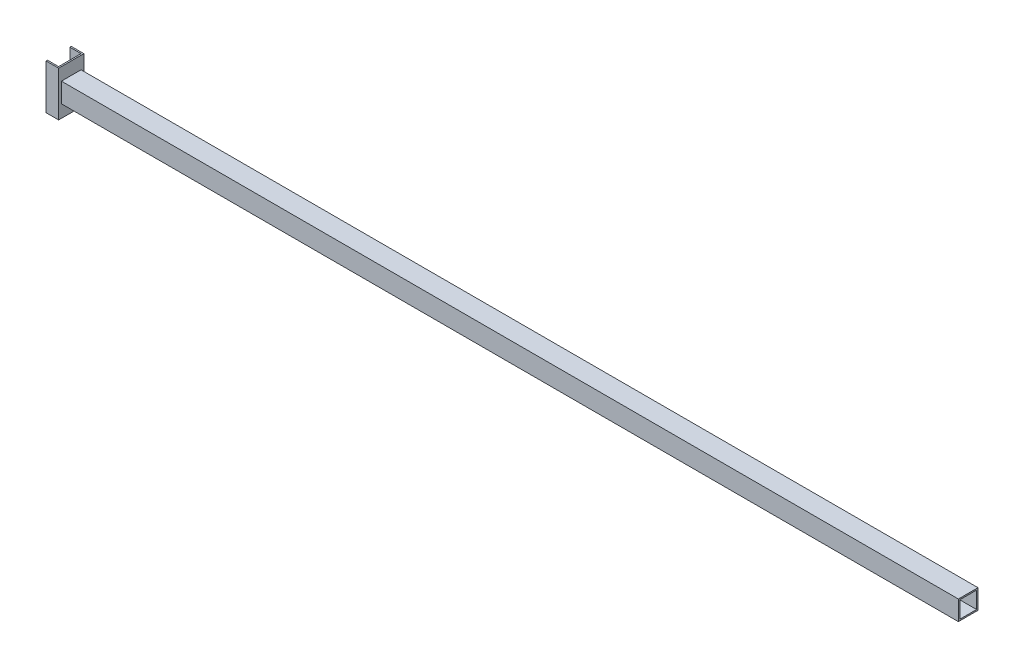
ISO-10303-21;
HEADER;
FILE_DESCRIPTION(('STEP AP214'),'2;1');
FILE_NAME('part.step','',(''),(''),'','','');
FILE_SCHEMA(('AUTOMOTIVE_DESIGN { 1 0 10303 214 1 1 1 1 }'));
ENDSEC;
DATA;
#1=APPLICATION_CONTEXT('core data for automotive mechanical design processes');
#2=APPLICATION_PROTOCOL_DEFINITION('international standard','automotive_design',2000,#1);
#3=PRODUCT_CONTEXT('',#1,'mechanical');
#4=PRODUCT('Part','Part','',(#3));
#5=PRODUCT_RELATED_PRODUCT_CATEGORY('part','',(#4));
#6=PRODUCT_DEFINITION_FORMATION('','',#4);
#7=PRODUCT_DEFINITION_CONTEXT('part definition',#1,'design');
#8=PRODUCT_DEFINITION('design','',#6,#7);
#9=PRODUCT_DEFINITION_SHAPE('','',#8);
#10=(LENGTH_UNIT() NAMED_UNIT(*) SI_UNIT(.MILLI.,.METRE.));
#11=(NAMED_UNIT(*) PLANE_ANGLE_UNIT() SI_UNIT($,.RADIAN.));
#12=(NAMED_UNIT(*) SI_UNIT($,.STERADIAN.) SOLID_ANGLE_UNIT());
#13=UNCERTAINTY_MEASURE_WITH_UNIT(LENGTH_MEASURE(1.E-05),#10,'distance_accuracy_value','');
#14=(GEOMETRIC_REPRESENTATION_CONTEXT(3) GLOBAL_UNCERTAINTY_ASSIGNED_CONTEXT((#13)) GLOBAL_UNIT_ASSIGNED_CONTEXT((#10,
#11,#12)) REPRESENTATION_CONTEXT('',''));
#15=CARTESIAN_POINT('',(0.,0.,0.));
#16=DIRECTION('',(0.,0.,1.));
#17=DIRECTION('',(1.,0.,0.));
#18=AXIS2_PLACEMENT_3D('',#15,#16,#17);
#19=CARTESIAN_POINT('',(-1.5875,0.,0.));
#20=DIRECTION('',(1.,0.,0.));
#21=DIRECTION('',(0.,0.,-1.));
#22=AXIS2_PLACEMENT_3D('',#19,#20,#21);
#23=PLANE('',#22);
#24=DIRECTION('',(0.,0.,1.));
#25=VECTOR('',#24,1.);
#26=CARTESIAN_POINT('',(-1.5875,19.05,-6.35000000000001));
#27=LINE('',#26,#25);
#28=CARTESIAN_POINT('',(-1.5875,19.05,-6.35000000000001));
#29=VERTEX_POINT('',#28);
#30=CARTESIAN_POINT('',(-1.5875,19.05,6.34999999999999));
#31=VERTEX_POINT('',#30);
#32=EDGE_CURVE('E214',#29,#31,#27,.T.);
#33=ORIENTED_EDGE('',*,*,#32,.T.);
#34=DIRECTION('',(0.,-1.,0.));
#35=VECTOR('',#34,1.);
#36=CARTESIAN_POINT('',(-1.5875,19.05,6.34999999999999));
#37=LINE('',#36,#35);
#38=CARTESIAN_POINT('',(-1.5875,12.7,6.34999999999999));
#39=VERTEX_POINT('',#38);
#40=EDGE_CURVE('E229',#31,#39,#37,.T.);
#41=ORIENTED_EDGE('',*,*,#40,.T.);
#42=DIRECTION('',(0.,0.,1.));
#43=VECTOR('',#42,1.);
#44=CARTESIAN_POINT('',(-1.5875,12.7,-6.35000000000001));
#45=LINE('',#44,#43);
#46=CARTESIAN_POINT('',(-1.5875,12.7,-6.35000000000001));
#47=VERTEX_POINT('',#46);
#48=EDGE_CURVE('E232',#47,#39,#45,.T.);
#49=ORIENTED_EDGE('',*,*,#48,.F.);
#50=DIRECTION('',(0.,-1.,0.));
#51=VECTOR('',#50,1.);
#52=CARTESIAN_POINT('',(-1.5875,19.05,-6.35000000000001));
#53=LINE('',#52,#51);
#54=EDGE_CURVE('E225',#29,#47,#53,.T.);
#55=ORIENTED_EDGE('',*,*,#54,.F.);
#56=EDGE_LOOP('',(#33,#41,#49,#55));
#57=FACE_BOUND('',#56,.T.);
#58=DIRECTION('',(0.,0.,-1.));
#59=VECTOR('',#58,1.);
#60=CARTESIAN_POINT('',(-1.5875,25.4,0.));
#61=LINE('',#60,#59);
#62=CARTESIAN_POINT('',(-1.5875,25.4,12.7));
#63=VERTEX_POINT('',#62);
#64=CARTESIAN_POINT('',(-1.5875,25.4,-12.7));
#65=VERTEX_POINT('',#64);
#66=EDGE_CURVE('E366',#63,#65,#61,.T.);
#67=ORIENTED_EDGE('',*,*,#66,.T.);
#68=DIRECTION('',(0.,-1.,0.));
#69=VECTOR('',#68,1.);
#70=CARTESIAN_POINT('',(-1.5875,0.,-12.7));
#71=LINE('',#70,#69);
#72=CARTESIAN_POINT('',(-1.5875,-25.4,-12.7));
#73=VERTEX_POINT('',#72);
#74=EDGE_CURVE('E337',#65,#73,#71,.T.);
#75=ORIENTED_EDGE('',*,*,#74,.T.);
#76=DIRECTION('',(0.,0.,-1.));
#77=VECTOR('',#76,1.);
#78=CARTESIAN_POINT('',(-1.5875,-25.4,0.));
#79=LINE('',#78,#77);
#80=CARTESIAN_POINT('',(-1.5875,-25.4,12.7));
#81=VERTEX_POINT('',#80);
#82=EDGE_CURVE('E363',#81,#73,#79,.T.);
#83=ORIENTED_EDGE('',*,*,#82,.F.);
#84=DIRECTION('',(0.,-1.,0.));
#85=VECTOR('',#84,1.);
#86=CARTESIAN_POINT('',(-1.5875,0.,12.7));
#87=LINE('',#86,#85);
#88=EDGE_CURVE('E357',#63,#81,#87,.T.);
#89=ORIENTED_EDGE('',*,*,#88,.F.);
#90=EDGE_LOOP('',(#67,#75,#83,#89));
#91=FACE_BOUND('',#90,.T.);
#92=DIRECTION('',(0.,0.,1.));
#93=VECTOR('',#92,1.);
#94=CARTESIAN_POINT('',(-1.5875,-6.35,-6.35000000000001));
#95=LINE('',#94,#93);
#96=CARTESIAN_POINT('',(-1.5875,-6.35,-6.35000000000002));
#97=VERTEX_POINT('',#96);
#98=CARTESIAN_POINT('',(-1.5875,-6.35,6.34999999999998));
#99=VERTEX_POINT('',#98);
#100=EDGE_CURVE('E55',#97,#99,#95,.T.);
#101=ORIENTED_EDGE('',*,*,#100,.T.);
#102=DIRECTION('',(0.,-1.,0.));
#103=VECTOR('',#102,1.);
#104=CARTESIAN_POINT('',(-1.5875,-6.35,6.34999999999999));
#105=LINE('',#104,#103);
#106=CARTESIAN_POINT('',(-1.5875,-12.7,6.34999999999999));
#107=VERTEX_POINT('',#106);
#108=EDGE_CURVE('E184',#99,#107,#105,.T.);
#109=ORIENTED_EDGE('',*,*,#108,.T.);
#110=DIRECTION('',(0.,0.,1.));
#111=VECTOR('',#110,1.);
#112=CARTESIAN_POINT('',(-1.5875,-12.7,-6.35000000000001));
#113=LINE('',#112,#111);
#114=CARTESIAN_POINT('',(-1.5875,-12.7,-6.35000000000001));
#115=VERTEX_POINT('',#114);
#116=EDGE_CURVE('E186',#115,#107,#113,.T.);
#117=ORIENTED_EDGE('',*,*,#116,.F.);
#118=DIRECTION('',(0.,-1.,0.));
#119=VECTOR('',#118,1.);
#120=CARTESIAN_POINT('',(-1.5875,-6.35,-6.35000000000001));
#121=LINE('',#120,#119);
#122=EDGE_CURVE('E60',#97,#115,#121,.T.);
#123=ORIENTED_EDGE('',*,*,#122,.F.);
#124=EDGE_LOOP('',(#101,#109,#117,#123));
#125=FACE_BOUND('',#124,.T.);
#126=ADVANCED_FACE('F38',(#57,#91,#125),#23,.F.);
#127=CARTESIAN_POINT('',(0.,0.,0.));
#128=DIRECTION('',(1.,0.,0.));
#129=DIRECTION('',(0.,0.,-1.));
#130=AXIS2_PLACEMENT_3D('',#127,#128,#129);
#131=PLANE('',#130);
#132=DIRECTION('',(0.,0.,-1.));
#133=VECTOR('',#132,1.);
#134=CARTESIAN_POINT('',(0.,-25.4,0.));
#135=LINE('',#134,#133);
#136=CARTESIAN_POINT('',(0.,-25.4,14.2875));
#137=VERTEX_POINT('',#136);
#138=CARTESIAN_POINT('',(0.,-25.4,-14.2875));
#139=VERTEX_POINT('',#138);
#140=EDGE_CURVE('E362',#137,#139,#135,.T.);
#141=ORIENTED_EDGE('',*,*,#140,.T.);
#142=DIRECTION('',(0.,1.,0.));
#143=VECTOR('',#142,1.);
#144=CARTESIAN_POINT('',(0.,0.,-14.2875));
#145=LINE('',#144,#143);
#146=CARTESIAN_POINT('',(0.,25.4,-14.2875));
#147=VERTEX_POINT('',#146);
#148=EDGE_CURVE('E371',#139,#147,#145,.T.);
#149=ORIENTED_EDGE('',*,*,#148,.T.);
#150=DIRECTION('',(0.,0.,-1.));
#151=VECTOR('',#150,1.);
#152=CARTESIAN_POINT('',(0.,25.4,0.));
#153=LINE('',#152,#151);
#154=CARTESIAN_POINT('',(0.,25.4,14.2875));
#155=VERTEX_POINT('',#154);
#156=EDGE_CURVE('E374',#155,#147,#153,.T.);
#157=ORIENTED_EDGE('',*,*,#156,.F.);
#158=DIRECTION('',(0.,1.,0.));
#159=VECTOR('',#158,1.);
#160=CARTESIAN_POINT('',(0.,0.,14.2875));
#161=LINE('',#160,#159);
#162=EDGE_CURVE('E367',#137,#155,#161,.T.);
#163=ORIENTED_EDGE('',*,*,#162,.F.);
#164=EDGE_LOOP('',(#141,#149,#157,#163));
#165=FACE_BOUND('',#164,.T.);
#166=DIRECTION('',(0.,1.,0.));
#167=VECTOR('',#166,1.);
#168=CARTESIAN_POINT('',(0.,0.,-11.1125));
#169=LINE('',#168,#167);
#170=CARTESIAN_POINT('',(0.,-11.1125,-11.1125));
#171=VERTEX_POINT('',#170);
#172=CARTESIAN_POINT('',(0.,11.1125,-11.1125));
#173=VERTEX_POINT('',#172);
#174=EDGE_CURVE('E283',#171,#173,#169,.T.);
#175=ORIENTED_EDGE('',*,*,#174,.F.);
#176=DIRECTION('',(0.,0.,-1.));
#177=VECTOR('',#176,1.);
#178=CARTESIAN_POINT('',(0.,-11.1125,0.));
#179=LINE('',#178,#177);
#180=CARTESIAN_POINT('',(0.,-11.1125,11.1125));
#181=VERTEX_POINT('',#180);
#182=EDGE_CURVE('E228',#181,#171,#179,.T.);
#183=ORIENTED_EDGE('',*,*,#182,.F.);
#184=DIRECTION('',(0.,1.,0.));
#185=VECTOR('',#184,1.);
#186=CARTESIAN_POINT('',(0.,0.,11.1125));
#187=LINE('',#186,#185);
#188=CARTESIAN_POINT('',(0.,11.1125,11.1125));
#189=VERTEX_POINT('',#188);
#190=EDGE_CURVE('E288',#181,#189,#187,.T.);
#191=ORIENTED_EDGE('',*,*,#190,.T.);
#192=DIRECTION('',(0.,0.,-1.));
#193=VECTOR('',#192,1.);
#194=CARTESIAN_POINT('',(0.,11.1125,0.));
#195=LINE('',#194,#193);
#196=EDGE_CURVE('E286',#189,#173,#195,.T.);
#197=ORIENTED_EDGE('',*,*,#196,.T.);
#198=EDGE_LOOP('',(#175,#183,#191,#197));
#199=FACE_BOUND('',#198,.T.);
#200=ADVANCED_FACE('F390',(#165,#199),#131,.T.);
#201=CARTESIAN_POINT('',(-1.5875,-25.4,0.));
#202=DIRECTION('',(0.,-1.,0.));
#203=DIRECTION('',(0.,0.,-1.));
#204=AXIS2_PLACEMENT_3D('',#201,#202,#203);
#205=PLANE('',#204);
#206=ORIENTED_EDGE('',*,*,#82,.T.);
#207=DIRECTION('',(1.,0.,0.));
#208=VECTOR('',#207,1.);
#209=CARTESIAN_POINT('',(-14.2875,-25.4,-12.7));
#210=LINE('',#209,#208);
#211=CARTESIAN_POINT('',(-14.2875,-25.4,-12.7));
#212=VERTEX_POINT('',#211);
#213=EDGE_CURVE('E335',#212,#73,#210,.T.);
#214=ORIENTED_EDGE('',*,*,#213,.F.);
#215=DIRECTION('',(0.,0.,-1.));
#216=VECTOR('',#215,1.);
#217=CARTESIAN_POINT('',(-14.2875,-25.4,0.));
#218=LINE('',#217,#216);
#219=CARTESIAN_POINT('',(-14.2875,-25.4,-14.2875));
#220=VERTEX_POINT('',#219);
#221=EDGE_CURVE('E328',#212,#220,#218,.T.);
#222=ORIENTED_EDGE('',*,*,#221,.T.);
#223=DIRECTION('',(1.,0.,0.));
#224=VECTOR('',#223,1.);
#225=CARTESIAN_POINT('',(-1.5875,-25.4,-14.2875));
#226=LINE('',#225,#224);
#227=EDGE_CURVE('E42',#220,#139,#226,.T.);
#228=ORIENTED_EDGE('',*,*,#227,.T.);
#229=ORIENTED_EDGE('',*,*,#140,.F.);
#230=DIRECTION('',(1.,0.,0.));
#231=VECTOR('',#230,1.);
#232=CARTESIAN_POINT('',(-1.5875,-25.4,14.2875));
#233=LINE('',#232,#231);
#234=CARTESIAN_POINT('',(-14.2875,-25.4,14.2875));
#235=VERTEX_POINT('',#234);
#236=EDGE_CURVE('E12',#235,#137,#233,.T.);
#237=ORIENTED_EDGE('',*,*,#236,.F.);
#238=DIRECTION('',(0.,0.,-1.));
#239=VECTOR('',#238,1.);
#240=CARTESIAN_POINT('',(-14.2875,-25.4,0.));
#241=LINE('',#240,#239);
#242=CARTESIAN_POINT('',(-14.2875,-25.4,12.7));
#243=VERTEX_POINT('',#242);
#244=EDGE_CURVE('E348',#235,#243,#241,.T.);
#245=ORIENTED_EDGE('',*,*,#244,.T.);
#246=DIRECTION('',(1.,0.,0.));
#247=VECTOR('',#246,1.);
#248=CARTESIAN_POINT('',(-14.2875,-25.4,12.7));
#249=LINE('',#248,#247);
#250=EDGE_CURVE('E353',#243,#81,#249,.T.);
#251=ORIENTED_EDGE('',*,*,#250,.T.);
#252=EDGE_LOOP('',(#206,#214,#222,#228,#229,#237,#245,#251));
#253=FACE_BOUND('',#252,.T.);
#254=ADVANCED_FACE('F40',(#253),#205,.T.);
#255=CARTESIAN_POINT('',(-1.5875,0.,14.2875));
#256=DIRECTION('',(0.,0.,-1.));
#257=DIRECTION('',(-1.,0.,0.));
#258=AXIS2_PLACEMENT_3D('',#255,#256,#257);
#259=PLANE('',#258);
#260=ORIENTED_EDGE('',*,*,#162,.T.);
#261=DIRECTION('',(1.,0.,0.));
#262=VECTOR('',#261,1.);
#263=CARTESIAN_POINT('',(-1.5875,25.4,14.2875));
#264=LINE('',#263,#262);
#265=CARTESIAN_POINT('',(-14.2875,25.4,14.2875));
#266=VERTEX_POINT('',#265);
#267=EDGE_CURVE('E47',#266,#155,#264,.T.);
#268=ORIENTED_EDGE('',*,*,#267,.F.);
#269=DIRECTION('',(0.,1.,0.));
#270=VECTOR('',#269,1.);
#271=CARTESIAN_POINT('',(-14.2875,0.,14.2875));
#272=LINE('',#271,#270);
#273=EDGE_CURVE('E345',#235,#266,#272,.T.);
#274=ORIENTED_EDGE('',*,*,#273,.F.);
#275=ORIENTED_EDGE('',*,*,#236,.T.);
#276=EDGE_LOOP('',(#260,#268,#274,#275));
#277=FACE_BOUND('',#276,.T.);
#278=ADVANCED_FACE('F394',(#277),#259,.F.);
#279=CARTESIAN_POINT('',(-1.5875,25.4,0.));
#280=DIRECTION('',(0.,-1.,0.));
#281=DIRECTION('',(0.,0.,-1.));
#282=AXIS2_PLACEMENT_3D('',#279,#280,#281);
#283=PLANE('',#282);
#284=ORIENTED_EDGE('',*,*,#156,.T.);
#285=DIRECTION('',(1.,0.,0.));
#286=VECTOR('',#285,1.);
#287=CARTESIAN_POINT('',(-1.5875,25.4,-14.2875));
#288=LINE('',#287,#286);
#289=CARTESIAN_POINT('',(-14.2875,25.4,-14.2875));
#290=VERTEX_POINT('',#289);
#291=EDGE_CURVE('E378',#290,#147,#288,.T.);
#292=ORIENTED_EDGE('',*,*,#291,.F.);
#293=DIRECTION('',(0.,0.,-1.));
#294=VECTOR('',#293,1.);
#295=CARTESIAN_POINT('',(-14.2875,25.4,0.));
#296=LINE('',#295,#294);
#297=CARTESIAN_POINT('',(-14.2875,25.4,-12.7));
#298=VERTEX_POINT('',#297);
#299=EDGE_CURVE('E312',#298,#290,#296,.T.);
#300=ORIENTED_EDGE('',*,*,#299,.F.);
#301=DIRECTION('',(1.,0.,0.));
#302=VECTOR('',#301,1.);
#303=CARTESIAN_POINT('',(-14.2875,25.4,-12.7));
#304=LINE('',#303,#302);
#305=EDGE_CURVE('E334',#298,#65,#304,.T.);
#306=ORIENTED_EDGE('',*,*,#305,.T.);
#307=ORIENTED_EDGE('',*,*,#66,.F.);
#308=DIRECTION('',(1.,0.,0.));
#309=VECTOR('',#308,1.);
#310=CARTESIAN_POINT('',(-14.2875,25.4,12.7));
#311=LINE('',#310,#309);
#312=CARTESIAN_POINT('',(-14.2875,25.4,12.7));
#313=VERTEX_POINT('',#312);
#314=EDGE_CURVE('E354',#313,#63,#311,.T.);
#315=ORIENTED_EDGE('',*,*,#314,.F.);
#316=DIRECTION('',(0.,0.,-1.));
#317=VECTOR('',#316,1.);
#318=CARTESIAN_POINT('',(-14.2875,25.4,0.));
#319=LINE('',#318,#317);
#320=EDGE_CURVE('E342',#266,#313,#319,.T.);
#321=ORIENTED_EDGE('',*,*,#320,.F.);
#322=ORIENTED_EDGE('',*,*,#267,.T.);
#323=EDGE_LOOP('',(#284,#292,#300,#306,#307,#315,#321,#322));
#324=FACE_BOUND('',#323,.T.);
#325=ADVANCED_FACE('F398',(#324),#283,.F.);
#326=CARTESIAN_POINT('',(-1.5875,0.,-14.2875));
#327=DIRECTION('',(0.,0.,-1.));
#328=DIRECTION('',(-1.,0.,0.));
#329=AXIS2_PLACEMENT_3D('',#326,#327,#328);
#330=PLANE('',#329);
#331=ORIENTED_EDGE('',*,*,#148,.F.);
#332=ORIENTED_EDGE('',*,*,#227,.F.);
#333=DIRECTION('',(0.,1.,0.));
#334=VECTOR('',#333,1.);
#335=CARTESIAN_POINT('',(-14.2875,0.,-14.2875));
#336=LINE('',#335,#334);
#337=EDGE_CURVE('E331',#220,#290,#336,.T.);
#338=ORIENTED_EDGE('',*,*,#337,.T.);
#339=ORIENTED_EDGE('',*,*,#291,.T.);
#340=EDGE_LOOP('',(#331,#332,#338,#339));
#341=FACE_BOUND('',#340,.T.);
#342=ADVANCED_FACE('F387',(#341),#330,.T.);
#343=CARTESIAN_POINT('',(-14.2875,0.,12.7));
#344=DIRECTION('',(0.,0.,1.));
#345=DIRECTION('',(0.,-1.,0.));
#346=AXIS2_PLACEMENT_3D('',#343,#344,#345);
#347=PLANE('',#346);
#348=ORIENTED_EDGE('',*,*,#314,.T.);
#349=ORIENTED_EDGE('',*,*,#88,.T.);
#350=ORIENTED_EDGE('',*,*,#250,.F.);
#351=DIRECTION('',(0.,-1.,0.));
#352=VECTOR('',#351,1.);
#353=CARTESIAN_POINT('',(-14.2875,0.,12.7));
#354=LINE('',#353,#352);
#355=EDGE_CURVE('E351',#313,#243,#354,.T.);
#356=ORIENTED_EDGE('',*,*,#355,.F.);
#357=EDGE_LOOP('',(#348,#349,#350,#356));
#358=FACE_BOUND('',#357,.T.);
#359=ADVANCED_FACE('F406',(#358),#347,.F.);
#360=CARTESIAN_POINT('',(-14.2875,0.,0.));
#361=DIRECTION('',(1.,0.,0.));
#362=DIRECTION('',(0.,0.,-1.));
#363=AXIS2_PLACEMENT_3D('',#360,#361,#362);
#364=PLANE('',#363);
#365=ORIENTED_EDGE('',*,*,#320,.T.);
#366=ORIENTED_EDGE('',*,*,#355,.T.);
#367=ORIENTED_EDGE('',*,*,#244,.F.);
#368=ORIENTED_EDGE('',*,*,#273,.T.);
#369=EDGE_LOOP('',(#365,#366,#367,#368));
#370=FACE_BOUND('',#369,.T.);
#371=ADVANCED_FACE('F402',(#370),#364,.F.);
#372=CARTESIAN_POINT('',(-14.2875,0.,-12.7));
#373=DIRECTION('',(0.,0.,1.));
#374=DIRECTION('',(0.,-1.,0.));
#375=AXIS2_PLACEMENT_3D('',#372,#373,#374);
#376=PLANE('',#375);
#377=ORIENTED_EDGE('',*,*,#74,.F.);
#378=ORIENTED_EDGE('',*,*,#305,.F.);
#379=DIRECTION('',(0.,-1.,0.));
#380=VECTOR('',#379,1.);
#381=CARTESIAN_POINT('',(-14.2875,0.,-12.7));
#382=LINE('',#381,#380);
#383=EDGE_CURVE('E325',#298,#212,#382,.T.);
#384=ORIENTED_EDGE('',*,*,#383,.T.);
#385=ORIENTED_EDGE('',*,*,#213,.T.);
#386=EDGE_LOOP('',(#377,#378,#384,#385));
#387=FACE_BOUND('',#386,.T.);
#388=ADVANCED_FACE('F411',(#387),#376,.T.);
#389=CARTESIAN_POINT('',(-14.2875,0.,0.));
#390=DIRECTION('',(1.,0.,0.));
#391=DIRECTION('',(0.,0.,-1.));
#392=AXIS2_PLACEMENT_3D('',#389,#390,#391);
#393=PLANE('',#392);
#394=ORIENTED_EDGE('',*,*,#299,.T.);
#395=ORIENTED_EDGE('',*,*,#337,.F.);
#396=ORIENTED_EDGE('',*,*,#221,.F.);
#397=ORIENTED_EDGE('',*,*,#383,.F.);
#398=EDGE_LOOP('',(#394,#395,#396,#397));
#399=FACE_BOUND('',#398,.T.);
#400=ADVANCED_FACE('F413',(#399),#393,.F.);
#401=CARTESIAN_POINT('',(1016.,-9.525,0.));
#402=DIRECTION('',(0.,1.,0.));
#403=DIRECTION('',(0.,0.,1.));
#404=AXIS2_PLACEMENT_3D('',#401,#402,#403);
#405=PLANE('',#404);
#406=DIRECTION('',(0.,0.,-1.));
#407=VECTOR('',#406,1.);
#408=CARTESIAN_POINT('',(0.,-9.525,0.));
#409=LINE('',#408,#407);
#410=CARTESIAN_POINT('',(0.,-9.525,9.525));
#411=VERTEX_POINT('',#410);
#412=CARTESIAN_POINT('',(0.,-9.525,-9.525));
#413=VERTEX_POINT('',#412);
#414=EDGE_CURVE('E290',#411,#413,#409,.T.);
#415=ORIENTED_EDGE('',*,*,#414,.F.);
#416=DIRECTION('',(-1.,0.,0.));
#417=VECTOR('',#416,1.);
#418=CARTESIAN_POINT('',(1016.,-9.525,9.525));
#419=LINE('',#418,#417);
#420=CARTESIAN_POINT('',(1016.,-9.525,9.525));
#421=VERTEX_POINT('',#420);
#422=EDGE_CURVE('E309',#421,#411,#419,.T.);
#423=ORIENTED_EDGE('',*,*,#422,.F.);
#424=DIRECTION('',(0.,0.,-1.));
#425=VECTOR('',#424,1.);
#426=CARTESIAN_POINT('',(1016.,-9.525,0.));
#427=LINE('',#426,#425);
#428=CARTESIAN_POINT('',(1016.,-9.525,-9.525));
#429=VERTEX_POINT('',#428);
#430=EDGE_CURVE('E269',#421,#429,#427,.T.);
#431=ORIENTED_EDGE('',*,*,#430,.T.);
#432=DIRECTION('',(-1.,0.,0.));
#433=VECTOR('',#432,1.);
#434=CARTESIAN_POINT('',(1016.,-9.525,-9.525));
#435=LINE('',#434,#433);
#436=EDGE_CURVE('E299',#429,#413,#435,.T.);
#437=ORIENTED_EDGE('',*,*,#436,.T.);
#438=EDGE_LOOP('',(#415,#423,#431,#437));
#439=FACE_BOUND('',#438,.T.);
#440=ADVANCED_FACE('F415',(#439),#405,.T.);
#441=CARTESIAN_POINT('',(1016.,0.,9.525));
#442=DIRECTION('',(0.,0.,1.));
#443=DIRECTION('',(1.,0.,0.));
#444=AXIS2_PLACEMENT_3D('',#441,#442,#443);
#445=PLANE('',#444);
#446=DIRECTION('',(0.,1.,0.));
#447=VECTOR('',#446,1.);
#448=CARTESIAN_POINT('',(0.,0.,9.525));
#449=LINE('',#448,#447);
#450=CARTESIAN_POINT('',(0.,9.525,9.525));
#451=VERTEX_POINT('',#450);
#452=EDGE_CURVE('E292',#411,#451,#449,.T.);
#453=ORIENTED_EDGE('',*,*,#452,.T.);
#454=DIRECTION('',(-1.,0.,0.));
#455=VECTOR('',#454,1.);
#456=CARTESIAN_POINT('',(1016.,9.525,9.525));
#457=LINE('',#456,#455);
#458=CARTESIAN_POINT('',(1016.,9.525,9.525));
#459=VERTEX_POINT('',#458);
#460=EDGE_CURVE('E306',#459,#451,#457,.T.);
#461=ORIENTED_EDGE('',*,*,#460,.F.);
#462=DIRECTION('',(0.,1.,0.));
#463=VECTOR('',#462,1.);
#464=CARTESIAN_POINT('',(1016.,0.,9.525));
#465=LINE('',#464,#463);
#466=EDGE_CURVE('E272',#421,#459,#465,.T.);
#467=ORIENTED_EDGE('',*,*,#466,.F.);
#468=ORIENTED_EDGE('',*,*,#422,.T.);
#469=EDGE_LOOP('',(#453,#461,#467,#468));
#470=FACE_BOUND('',#469,.T.);
#471=ADVANCED_FACE('F421',(#470),#445,.F.);
#472=CARTESIAN_POINT('',(1016.,9.525,0.));
#473=DIRECTION('',(0.,1.,0.));
#474=DIRECTION('',(0.,0.,1.));
#475=AXIS2_PLACEMENT_3D('',#472,#473,#474);
#476=PLANE('',#475);
#477=DIRECTION('',(0.,0.,-1.));
#478=VECTOR('',#477,1.);
#479=CARTESIAN_POINT('',(0.,9.525,0.));
#480=LINE('',#479,#478);
#481=CARTESIAN_POINT('',(0.,9.525,-9.525));
#482=VERTEX_POINT('',#481);
#483=EDGE_CURVE('E295',#451,#482,#480,.T.);
#484=ORIENTED_EDGE('',*,*,#483,.T.);
#485=DIRECTION('',(-1.,0.,0.));
#486=VECTOR('',#485,1.);
#487=CARTESIAN_POINT('',(1016.,9.525,-9.525));
#488=LINE('',#487,#486);
#489=CARTESIAN_POINT('',(1016.,9.525,-9.525));
#490=VERTEX_POINT('',#489);
#491=EDGE_CURVE('E302',#490,#482,#488,.T.);
#492=ORIENTED_EDGE('',*,*,#491,.F.);
#493=DIRECTION('',(0.,0.,-1.));
#494=VECTOR('',#493,1.);
#495=CARTESIAN_POINT('',(1016.,9.525,0.));
#496=LINE('',#495,#494);
#497=EDGE_CURVE('E275',#459,#490,#496,.T.);
#498=ORIENTED_EDGE('',*,*,#497,.F.);
#499=ORIENTED_EDGE('',*,*,#460,.T.);
#500=EDGE_LOOP('',(#484,#492,#498,#499));
#501=FACE_BOUND('',#500,.T.);
#502=ADVANCED_FACE('F486',(#501),#476,.F.);
#503=CARTESIAN_POINT('',(1016.,-11.1125,0.));
#504=DIRECTION('',(0.,1.,0.));
#505=DIRECTION('',(0.,0.,1.));
#506=AXIS2_PLACEMENT_3D('',#503,#504,#505);
#507=PLANE('',#506);
#508=ORIENTED_EDGE('',*,*,#182,.T.);
#509=DIRECTION('',(-1.,0.,0.));
#510=VECTOR('',#509,1.);
#511=CARTESIAN_POINT('',(1016.,-11.1125,-11.1125));
#512=LINE('',#511,#510);
#513=CARTESIAN_POINT('',(1016.,-11.1125,-11.1125));
#514=VERTEX_POINT('',#513);
#515=EDGE_CURVE('E303',#514,#171,#512,.T.);
#516=ORIENTED_EDGE('',*,*,#515,.F.);
#517=DIRECTION('',(0.,0.,-1.));
#518=VECTOR('',#517,1.);
#519=CARTESIAN_POINT('',(1016.,-11.1125,0.));
#520=LINE('',#519,#518);
#521=CARTESIAN_POINT('',(1016.,-11.1125,11.1125));
#522=VERTEX_POINT('',#521);
#523=EDGE_CURVE('E257',#522,#514,#520,.T.);
#524=ORIENTED_EDGE('',*,*,#523,.F.);
#525=DIRECTION('',(-1.,0.,0.));
#526=VECTOR('',#525,1.);
#527=CARTESIAN_POINT('',(1016.,-11.1125,11.1125));
#528=LINE('',#527,#526);
#529=EDGE_CURVE('E280',#522,#181,#528,.T.);
#530=ORIENTED_EDGE('',*,*,#529,.T.);
#531=EDGE_LOOP('',(#508,#516,#524,#530));
#532=FACE_BOUND('',#531,.T.);
#533=ADVANCED_FACE('F496',(#532),#507,.F.);
#534=CARTESIAN_POINT('',(1016.,0.,-11.1125));
#535=DIRECTION('',(0.,0.,1.));
#536=DIRECTION('',(1.,0.,0.));
#537=AXIS2_PLACEMENT_3D('',#534,#535,#536);
#538=PLANE('',#537);
#539=ORIENTED_EDGE('',*,*,#174,.T.);
#540=DIRECTION('',(-1.,0.,0.));
#541=VECTOR('',#540,1.);
#542=CARTESIAN_POINT('',(1016.,11.1125,-11.1125));
#543=LINE('',#542,#541);
#544=CARTESIAN_POINT('',(1016.,11.1125,-11.1125));
#545=VERTEX_POINT('',#544);
#546=EDGE_CURVE('E318',#545,#173,#543,.T.);
#547=ORIENTED_EDGE('',*,*,#546,.F.);
#548=DIRECTION('',(0.,1.,0.));
#549=VECTOR('',#548,1.);
#550=CARTESIAN_POINT('',(1016.,0.,-11.1125));
#551=LINE('',#550,#549);
#552=EDGE_CURVE('E260',#514,#545,#551,.T.);
#553=ORIENTED_EDGE('',*,*,#552,.F.);
#554=ORIENTED_EDGE('',*,*,#515,.T.);
#555=EDGE_LOOP('',(#539,#547,#553,#554));
#556=FACE_BOUND('',#555,.T.);
#557=ADVANCED_FACE('F506',(#556),#538,.F.);
#558=CARTESIAN_POINT('',(1016.,11.1125,0.));
#559=DIRECTION('',(0.,1.,0.));
#560=DIRECTION('',(0.,0.,1.));
#561=AXIS2_PLACEMENT_3D('',#558,#559,#560);
#562=PLANE('',#561);
#563=ORIENTED_EDGE('',*,*,#196,.F.);
#564=DIRECTION('',(-1.,0.,0.));
#565=VECTOR('',#564,1.);
#566=CARTESIAN_POINT('',(1016.,11.1125,11.1125));
#567=LINE('',#566,#565);
#568=CARTESIAN_POINT('',(1016.,11.1125,11.1125));
#569=VERTEX_POINT('',#568);
#570=EDGE_CURVE('E315',#569,#189,#567,.T.);
#571=ORIENTED_EDGE('',*,*,#570,.F.);
#572=DIRECTION('',(0.,0.,-1.));
#573=VECTOR('',#572,1.);
#574=CARTESIAN_POINT('',(1016.,11.1125,0.));
#575=LINE('',#574,#573);
#576=EDGE_CURVE('E263',#569,#545,#575,.T.);
#577=ORIENTED_EDGE('',*,*,#576,.T.);
#578=ORIENTED_EDGE('',*,*,#546,.T.);
#579=EDGE_LOOP('',(#563,#571,#577,#578));
#580=FACE_BOUND('',#579,.T.);
#581=ADVANCED_FACE('F515',(#580),#562,.T.);
#582=CARTESIAN_POINT('',(1016.,0.,11.1125));
#583=DIRECTION('',(0.,0.,1.));
#584=DIRECTION('',(1.,0.,0.));
#585=AXIS2_PLACEMENT_3D('',#582,#583,#584);
#586=PLANE('',#585);
#587=ORIENTED_EDGE('',*,*,#190,.F.);
#588=ORIENTED_EDGE('',*,*,#529,.F.);
#589=DIRECTION('',(0.,1.,0.));
#590=VECTOR('',#589,1.);
#591=CARTESIAN_POINT('',(1016.,0.,11.1125));
#592=LINE('',#591,#590);
#593=EDGE_CURVE('E266',#522,#569,#592,.T.);
#594=ORIENTED_EDGE('',*,*,#593,.T.);
#595=ORIENTED_EDGE('',*,*,#570,.T.);
#596=EDGE_LOOP('',(#587,#588,#594,#595));
#597=FACE_BOUND('',#596,.T.);
#598=ADVANCED_FACE('F525',(#597),#586,.T.);
#599=CARTESIAN_POINT('',(1016.,0.,-9.525));
#600=DIRECTION('',(0.,0.,1.));
#601=DIRECTION('',(1.,0.,0.));
#602=AXIS2_PLACEMENT_3D('',#599,#600,#601);
#603=PLANE('',#602);
#604=DIRECTION('',(0.,1.,0.));
#605=VECTOR('',#604,1.);
#606=CARTESIAN_POINT('',(0.,0.,-9.525));
#607=LINE('',#606,#605);
#608=EDGE_CURVE('E261',#413,#482,#607,.T.);
#609=ORIENTED_EDGE('',*,*,#608,.F.);
#610=ORIENTED_EDGE('',*,*,#436,.F.);
#611=DIRECTION('',(0.,1.,0.));
#612=VECTOR('',#611,1.);
#613=CARTESIAN_POINT('',(1016.,0.,-9.525));
#614=LINE('',#613,#612);
#615=EDGE_CURVE('E277',#429,#490,#614,.T.);
#616=ORIENTED_EDGE('',*,*,#615,.T.);
#617=ORIENTED_EDGE('',*,*,#491,.T.);
#618=EDGE_LOOP('',(#609,#610,#616,#617));
#619=FACE_BOUND('',#618,.T.);
#620=ADVANCED_FACE('F535',(#619),#603,.T.);
#621=CARTESIAN_POINT('',(1016.,0.,0.));
#622=DIRECTION('',(1.,0.,0.));
#623=DIRECTION('',(0.,0.,-1.));
#624=AXIS2_PLACEMENT_3D('',#621,#622,#623);
#625=PLANE('',#624);
#626=ORIENTED_EDGE('',*,*,#523,.T.);
#627=ORIENTED_EDGE('',*,*,#552,.T.);
#628=ORIENTED_EDGE('',*,*,#576,.F.);
#629=ORIENTED_EDGE('',*,*,#593,.F.);
#630=EDGE_LOOP('',(#626,#627,#628,#629));
#631=FACE_BOUND('',#630,.T.);
#632=ORIENTED_EDGE('',*,*,#430,.F.);
#633=ORIENTED_EDGE('',*,*,#466,.T.);
#634=ORIENTED_EDGE('',*,*,#497,.T.);
#635=ORIENTED_EDGE('',*,*,#615,.F.);
#636=EDGE_LOOP('',(#632,#633,#634,#635));
#637=FACE_BOUND('',#636,.T.);
#638=ADVANCED_FACE('F439',(#631,#637),#625,.T.);
#639=ORIENTED_EDGE('',*,*,#414,.T.);
#640=ORIENTED_EDGE('',*,*,#608,.T.);
#641=ORIENTED_EDGE('',*,*,#483,.F.);
#642=ORIENTED_EDGE('',*,*,#452,.F.);
#643=EDGE_LOOP('',(#639,#640,#641,#642));
#644=FACE_BOUND('',#643,.T.);
#645=ADVANCED_FACE('F433',(#644),#131,.T.);
#646=CARTESIAN_POINT('',(0.,0.,6.34999999999999));
#647=DIRECTION('',(0.,0.,1.));
#648=DIRECTION('',(1.,0.,0.));
#649=AXIS2_PLACEMENT_3D('',#646,#647,#648);
#650=PLANE('',#649);
#651=ORIENTED_EDGE('',*,*,#40,.F.);
#652=DIRECTION('',(0.447213595499958,0.894427190999916,0.));
#653=VECTOR('',#652,1.);
#654=CARTESIAN_POINT('',(-4.7625,12.7,6.34999999999999));
#655=LINE('',#654,#653);
#656=CARTESIAN_POINT('',(-4.7625,12.7,6.34999999999999));
#657=VERTEX_POINT('',#656);
#658=EDGE_CURVE('E242',#657,#31,#655,.T.);
#659=ORIENTED_EDGE('',*,*,#658,.F.);
#660=DIRECTION('',(-1.,0.,0.));
#661=VECTOR('',#660,1.);
#662=CARTESIAN_POINT('',(-1.5875,12.7,6.34999999999999));
#663=LINE('',#662,#661);
#664=EDGE_CURVE('E216',#39,#657,#663,.T.);
#665=ORIENTED_EDGE('',*,*,#664,.F.);
#666=EDGE_LOOP('',(#651,#659,#665));
#667=FACE_BOUND('',#666,.T.);
#668=ADVANCED_FACE('F438',(#667),#650,.T.);
#669=CARTESIAN_POINT('',(0.,0.,-6.35000000000001));
#670=DIRECTION('',(0.,0.,1.));
#671=DIRECTION('',(1.,0.,0.));
#672=AXIS2_PLACEMENT_3D('',#669,#670,#671);
#673=PLANE('',#672);
#674=ORIENTED_EDGE('',*,*,#54,.T.);
#675=DIRECTION('',(-1.,0.,0.));
#676=VECTOR('',#675,1.);
#677=CARTESIAN_POINT('',(-1.5875,12.7,-6.35000000000001));
#678=LINE('',#677,#676);
#679=CARTESIAN_POINT('',(-4.7625,12.7,-6.35000000000001));
#680=VERTEX_POINT('',#679);
#681=EDGE_CURVE('E235',#47,#680,#678,.T.);
#682=ORIENTED_EDGE('',*,*,#681,.T.);
#683=DIRECTION('',(0.447213595499958,0.894427190999916,0.));
#684=VECTOR('',#683,1.);
#685=CARTESIAN_POINT('',(-4.7625,12.7,-6.35000000000001));
#686=LINE('',#685,#684);
#687=EDGE_CURVE('E217',#680,#29,#686,.T.);
#688=ORIENTED_EDGE('',*,*,#687,.T.);
#689=EDGE_LOOP('',(#674,#682,#688));
#690=FACE_BOUND('',#689,.T.);
#691=ADVANCED_FACE('F571',(#690),#673,.F.);
#692=CARTESIAN_POINT('',(-4.7625,12.7,-6.35000000000001));
#693=DIRECTION('',(0.894427190999916,-0.447213595499958,0.));
#694=DIRECTION('',(0.447213595499958,0.894427190999916,0.));
#695=AXIS2_PLACEMENT_3D('',#692,#693,#694);
#696=PLANE('',#695);
#697=ORIENTED_EDGE('',*,*,#658,.T.);
#698=ORIENTED_EDGE('',*,*,#32,.F.);
#699=ORIENTED_EDGE('',*,*,#687,.F.);
#700=DIRECTION('',(0.,0.,1.));
#701=VECTOR('',#700,1.);
#702=CARTESIAN_POINT('',(-4.7625,12.7,-6.35000000000001));
#703=LINE('',#702,#701);
#704=EDGE_CURVE('E222',#680,#657,#703,.T.);
#705=ORIENTED_EDGE('',*,*,#704,.T.);
#706=EDGE_LOOP('',(#697,#698,#699,#705));
#707=FACE_BOUND('',#706,.T.);
#708=ADVANCED_FACE('F581',(#707),#696,.F.);
#709=CARTESIAN_POINT('',(-1.5875,12.7,-6.35000000000001));
#710=DIRECTION('',(0.,1.,0.));
#711=DIRECTION('',(-1.,0.,0.));
#712=AXIS2_PLACEMENT_3D('',#709,#710,#711);
#713=PLANE('',#712);
#714=ORIENTED_EDGE('',*,*,#664,.T.);
#715=ORIENTED_EDGE('',*,*,#704,.F.);
#716=ORIENTED_EDGE('',*,*,#681,.F.);
#717=ORIENTED_EDGE('',*,*,#48,.T.);
#718=EDGE_LOOP('',(#714,#715,#716,#717));
#719=FACE_BOUND('',#718,.T.);
#720=ADVANCED_FACE('F441',(#719),#713,.F.);
#721=CARTESIAN_POINT('',(0.,0.,6.34999999999998));
#722=DIRECTION('',(0.,0.,1.));
#723=DIRECTION('',(1.,0.,0.));
#724=AXIS2_PLACEMENT_3D('',#721,#722,#723);
#725=PLANE('',#724);
#726=ORIENTED_EDGE('',*,*,#108,.F.);
#727=DIRECTION('',(0.447213595499958,0.894427190999916,0.));
#728=VECTOR('',#727,1.);
#729=CARTESIAN_POINT('',(-4.7625,-12.7,6.34999999999999));
#730=LINE('',#729,#728);
#731=CARTESIAN_POINT('',(-4.7625,-12.7,6.34999999999999));
#732=VERTEX_POINT('',#731);
#733=EDGE_CURVE('E201',#732,#99,#730,.T.);
#734=ORIENTED_EDGE('',*,*,#733,.F.);
#735=DIRECTION('',(-1.,0.,0.));
#736=VECTOR('',#735,1.);
#737=CARTESIAN_POINT('',(-1.5875,-12.7,6.34999999999999));
#738=LINE('',#737,#736);
#739=EDGE_CURVE('E196',#107,#732,#738,.T.);
#740=ORIENTED_EDGE('',*,*,#739,.F.);
#741=EDGE_LOOP('',(#726,#734,#740));
#742=FACE_BOUND('',#741,.T.);
#743=ADVANCED_FACE('F200',(#742),#725,.T.);
#744=CARTESIAN_POINT('',(0.,0.,-6.35000000000002));
#745=DIRECTION('',(0.,0.,1.));
#746=DIRECTION('',(1.,0.,0.));
#747=AXIS2_PLACEMENT_3D('',#744,#745,#746);
#748=PLANE('',#747);
#749=ORIENTED_EDGE('',*,*,#122,.T.);
#750=DIRECTION('',(-1.,0.,0.));
#751=VECTOR('',#750,1.);
#752=CARTESIAN_POINT('',(-1.5875,-12.7,-6.35000000000001));
#753=LINE('',#752,#751);
#754=CARTESIAN_POINT('',(-4.7625,-12.7,-6.35000000000001));
#755=VERTEX_POINT('',#754);
#756=EDGE_CURVE('E191',#115,#755,#753,.T.);
#757=ORIENTED_EDGE('',*,*,#756,.T.);
#758=DIRECTION('',(0.447213595499958,0.894427190999916,0.));
#759=VECTOR('',#758,1.);
#760=CARTESIAN_POINT('',(-4.7625,-12.7,-6.35000000000001));
#761=LINE('',#760,#759);
#762=EDGE_CURVE('E203',#755,#97,#761,.T.);
#763=ORIENTED_EDGE('',*,*,#762,.T.);
#764=EDGE_LOOP('',(#749,#757,#763));
#765=FACE_BOUND('',#764,.T.);
#766=ADVANCED_FACE('F615',(#765),#748,.F.);
#767=CARTESIAN_POINT('',(-4.7625,-12.7,-6.35000000000001));
#768=DIRECTION('',(0.894427190999916,-0.447213595499958,0.));
#769=DIRECTION('',(0.447213595499958,0.894427190999916,0.));
#770=AXIS2_PLACEMENT_3D('',#767,#768,#769);
#771=PLANE('',#770);
#772=ORIENTED_EDGE('',*,*,#733,.T.);
#773=ORIENTED_EDGE('',*,*,#100,.F.);
#774=ORIENTED_EDGE('',*,*,#762,.F.);
#775=DIRECTION('',(0.,0.,1.));
#776=VECTOR('',#775,1.);
#777=CARTESIAN_POINT('',(-4.7625,-12.7,-6.35000000000001));
#778=LINE('',#777,#776);
#779=EDGE_CURVE('E210',#755,#732,#778,.T.);
#780=ORIENTED_EDGE('',*,*,#779,.T.);
#781=EDGE_LOOP('',(#772,#773,#774,#780));
#782=FACE_BOUND('',#781,.T.);
#783=ADVANCED_FACE('F624',(#782),#771,.F.);
#784=CARTESIAN_POINT('',(-1.5875,-12.7,-6.35000000000001));
#785=DIRECTION('',(0.,1.,0.));
#786=DIRECTION('',(-1.,0.,0.));
#787=AXIS2_PLACEMENT_3D('',#784,#785,#786);
#788=PLANE('',#787);
#789=ORIENTED_EDGE('',*,*,#739,.T.);
#790=ORIENTED_EDGE('',*,*,#779,.F.);
#791=ORIENTED_EDGE('',*,*,#756,.F.);
#792=ORIENTED_EDGE('',*,*,#116,.T.);
#793=EDGE_LOOP('',(#789,#790,#791,#792));
#794=FACE_BOUND('',#793,.T.);
#795=ADVANCED_FACE('F194',(#794),#788,.F.);
#796=CLOSED_SHELL('',(#126,#200,#254,#278,#325,#342,#359,#371,#388,#400,#440,#471,#502,#533,
#557,#581,#598,#620,#638,#645,#668,#691,#708,#720,#743,#766,#783,#795));
#797=MANIFOLD_SOLID_BREP('B2',#796);
#798=ADVANCED_BREP_SHAPE_REPRESENTATION('',(#18,#797),#14);
#799=SHAPE_DEFINITION_REPRESENTATION(#9,#798);
ENDSEC;
END-ISO-10303-21;
